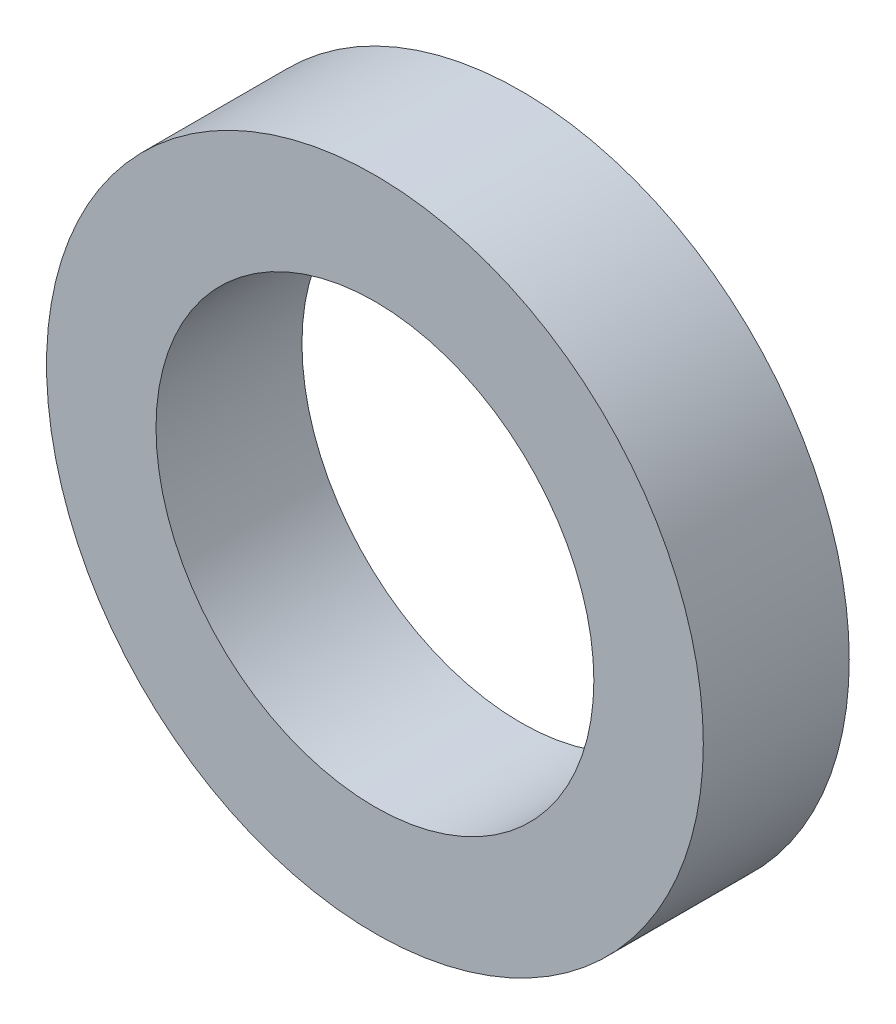
ISO-10303-21;
HEADER;
FILE_DESCRIPTION(('STEP AP214'),'2;1');
FILE_NAME('part.step','',(''),(''),'','','');
FILE_SCHEMA(('AUTOMOTIVE_DESIGN { 1 0 10303 214 1 1 1 1 }'));
ENDSEC;
DATA;
#1=APPLICATION_CONTEXT('core data for automotive mechanical design processes');
#2=APPLICATION_PROTOCOL_DEFINITION('international standard','automotive_design',2000,#1);
#3=PRODUCT_CONTEXT('',#1,'mechanical');
#4=PRODUCT('Part','Part','',(#3));
#5=PRODUCT_RELATED_PRODUCT_CATEGORY('part','',(#4));
#6=PRODUCT_DEFINITION_FORMATION('','',#4);
#7=PRODUCT_DEFINITION_CONTEXT('part definition',#1,'design');
#8=PRODUCT_DEFINITION('design','',#6,#7);
#9=PRODUCT_DEFINITION_SHAPE('','',#8);
#10=(LENGTH_UNIT() NAMED_UNIT(*) SI_UNIT(.MILLI.,.METRE.));
#11=(NAMED_UNIT(*) PLANE_ANGLE_UNIT() SI_UNIT($,.RADIAN.));
#12=(NAMED_UNIT(*) SI_UNIT($,.STERADIAN.) SOLID_ANGLE_UNIT());
#13=UNCERTAINTY_MEASURE_WITH_UNIT(LENGTH_MEASURE(1.E-05),#10,'distance_accuracy_value','');
#14=(GEOMETRIC_REPRESENTATION_CONTEXT(3) GLOBAL_UNCERTAINTY_ASSIGNED_CONTEXT((#13)) GLOBAL_UNIT_ASSIGNED_CONTEXT((#10,
#11,#12)) REPRESENTATION_CONTEXT('',''));
#15=CARTESIAN_POINT('',(0.,0.,0.));
#16=DIRECTION('',(0.,0.,1.));
#17=DIRECTION('',(1.,0.,0.));
#18=AXIS2_PLACEMENT_3D('',#15,#16,#17);
#19=CARTESIAN_POINT('',(0.,0.,4.));
#20=DIRECTION('',(0.,0.,1.));
#21=DIRECTION('',(1.,0.,0.));
#22=AXIS2_PLACEMENT_3D('',#19,#20,#21);
#23=PLANE('',#22);
#24=CARTESIAN_POINT('',(0.,0.,4.));
#25=DIRECTION('',(0.,0.,1.));
#26=DIRECTION('',(1.,0.,0.));
#27=AXIS2_PLACEMENT_3D('',#24,#25,#26);
#28=CIRCLE('',#27,9.);
#29=CARTESIAN_POINT('',(9.,0.,4.));
#30=VERTEX_POINT('',#29);
#31=EDGE_CURVE('E10',#30,#30,#28,.T.);
#32=ORIENTED_EDGE('',*,*,#31,.T.);
#33=EDGE_LOOP('',(#32));
#34=FACE_BOUND('',#33,.T.);
#35=CARTESIAN_POINT('',(0.,0.,4.));
#36=DIRECTION('',(0.,0.,1.));
#37=DIRECTION('',(1.,0.,0.));
#38=AXIS2_PLACEMENT_3D('',#35,#36,#37);
#39=CIRCLE('',#38,6.);
#40=CARTESIAN_POINT('',(6.,0.,4.));
#41=VERTEX_POINT('',#40);
#42=EDGE_CURVE('E54',#41,#41,#39,.T.);
#43=ORIENTED_EDGE('',*,*,#42,.F.);
#44=EDGE_LOOP('',(#43));
#45=FACE_BOUND('',#44,.T.);
#46=ADVANCED_FACE('F41',(#34,#45),#23,.T.);
#47=CARTESIAN_POINT('',(0.,0.,0.));
#48=DIRECTION('',(0.,0.,1.));
#49=DIRECTION('',(1.,0.,0.));
#50=AXIS2_PLACEMENT_3D('',#47,#48,#49);
#51=PLANE('',#50);
#52=CARTESIAN_POINT('',(0.,0.,0.));
#53=DIRECTION('',(0.,0.,1.));
#54=DIRECTION('',(1.,0.,0.));
#55=AXIS2_PLACEMENT_3D('',#52,#53,#54);
#56=CIRCLE('',#55,9.);
#57=CARTESIAN_POINT('',(9.,0.,0.));
#58=VERTEX_POINT('',#57);
#59=EDGE_CURVE('E45',#58,#58,#56,.T.);
#60=ORIENTED_EDGE('',*,*,#59,.F.);
#61=EDGE_LOOP('',(#60));
#62=FACE_BOUND('',#61,.T.);
#63=CARTESIAN_POINT('',(0.,0.,0.));
#64=DIRECTION('',(0.,0.,1.));
#65=DIRECTION('',(1.,0.,0.));
#66=AXIS2_PLACEMENT_3D('',#63,#64,#65);
#67=CIRCLE('',#66,6.);
#68=CARTESIAN_POINT('',(6.,0.,0.));
#69=VERTEX_POINT('',#68);
#70=EDGE_CURVE('E56',#69,#69,#67,.T.);
#71=ORIENTED_EDGE('',*,*,#70,.T.);
#72=EDGE_LOOP('',(#71));
#73=FACE_BOUND('',#72,.T.);
#74=ADVANCED_FACE('F68',(#62,#73),#51,.F.);
#75=CARTESIAN_POINT('',(0.,0.,4.));
#76=DIRECTION('',(0.,0.,-1.));
#77=DIRECTION('',(-1.,0.,0.));
#78=AXIS2_PLACEMENT_3D('',#75,#76,#77);
#79=CYLINDRICAL_SURFACE('',#78,9.);
#80=ORIENTED_EDGE('',*,*,#31,.F.);
#81=EDGE_LOOP('',(#80));
#82=FACE_BOUND('',#81,.T.);
#83=ORIENTED_EDGE('',*,*,#59,.T.);
#84=EDGE_LOOP('',(#83));
#85=FACE_BOUND('',#84,.T.);
#86=ADVANCED_FACE('F43',(#82,#85),#79,.T.);
#87=CARTESIAN_POINT('',(0.,0.,4.));
#88=DIRECTION('',(0.,0.,-1.));
#89=DIRECTION('',(-1.,0.,0.));
#90=AXIS2_PLACEMENT_3D('',#87,#88,#89);
#91=CYLINDRICAL_SURFACE('',#90,6.);
#92=ORIENTED_EDGE('',*,*,#42,.T.);
#93=EDGE_LOOP('',(#92));
#94=FACE_BOUND('',#93,.T.);
#95=ORIENTED_EDGE('',*,*,#70,.F.);
#96=EDGE_LOOP('',(#95));
#97=FACE_BOUND('',#96,.T.);
#98=ADVANCED_FACE('F64',(#94,#97),#91,.F.);
#99=CLOSED_SHELL('',(#46,#74,#86,#98));
#100=MANIFOLD_SOLID_BREP('B2',#99);
#101=ADVANCED_BREP_SHAPE_REPRESENTATION('',(#18,#100),#14);
#102=SHAPE_DEFINITION_REPRESENTATION(#9,#101);
ENDSEC;
END-ISO-10303-21;
